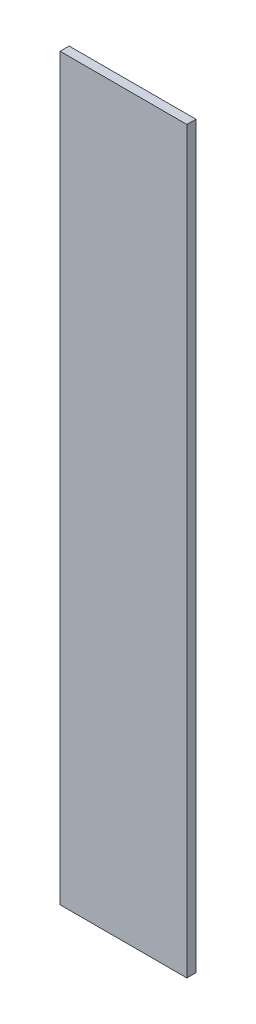
ISO-10303-21;
HEADER;
FILE_DESCRIPTION(('STEP AP214'),'2;1');
FILE_NAME('part.step','',(''),(''),'','','');
FILE_SCHEMA(('AUTOMOTIVE_DESIGN { 1 0 10303 214 1 1 1 1 }'));
ENDSEC;
DATA;
#1=APPLICATION_CONTEXT('core data for automotive mechanical design processes');
#2=APPLICATION_PROTOCOL_DEFINITION('international standard','automotive_design',2000,#1);
#3=PRODUCT_CONTEXT('',#1,'mechanical');
#4=PRODUCT('Part','Part','',(#3));
#5=PRODUCT_RELATED_PRODUCT_CATEGORY('part','',(#4));
#6=PRODUCT_DEFINITION_FORMATION('','',#4);
#7=PRODUCT_DEFINITION_CONTEXT('part definition',#1,'design');
#8=PRODUCT_DEFINITION('design','',#6,#7);
#9=PRODUCT_DEFINITION_SHAPE('','',#8);
#10=(LENGTH_UNIT() NAMED_UNIT(*) SI_UNIT(.MILLI.,.METRE.));
#11=(NAMED_UNIT(*) PLANE_ANGLE_UNIT() SI_UNIT($,.RADIAN.));
#12=(NAMED_UNIT(*) SI_UNIT($,.STERADIAN.) SOLID_ANGLE_UNIT());
#13=UNCERTAINTY_MEASURE_WITH_UNIT(LENGTH_MEASURE(1.E-05),#10,'distance_accuracy_value','');
#14=(GEOMETRIC_REPRESENTATION_CONTEXT(3) GLOBAL_UNCERTAINTY_ASSIGNED_CONTEXT((#13)) GLOBAL_UNIT_ASSIGNED_CONTEXT((#10,
#11,#12)) REPRESENTATION_CONTEXT('',''));
#15=CARTESIAN_POINT('',(0.,0.,0.));
#16=DIRECTION('',(0.,0.,1.));
#17=DIRECTION('',(1.,0.,0.));
#18=AXIS2_PLACEMENT_3D('',#15,#16,#17);
#19=CARTESIAN_POINT('',(0.,0.,6.35));
#20=DIRECTION('',(0.,1.,0.));
#21=DIRECTION('',(0.,0.,1.));
#22=AXIS2_PLACEMENT_3D('',#19,#20,#21);
#23=PLANE('',#22);
#24=DIRECTION('',(1.,0.,0.));
#25=VECTOR('',#24,1.);
#26=CARTESIAN_POINT('',(0.,0.,0.));
#27=LINE('',#26,#25);
#28=CARTESIAN_POINT('',(-88.9,0.,0.));
#29=VERTEX_POINT('',#28);
#30=CARTESIAN_POINT('',(0.,0.,0.));
#31=VERTEX_POINT('',#30);
#32=EDGE_CURVE('E113',#29,#31,#27,.T.);
#33=ORIENTED_EDGE('',*,*,#32,.T.);
#34=DIRECTION('',(0.,0.,-1.));
#35=VECTOR('',#34,1.);
#36=CARTESIAN_POINT('',(0.,0.,6.35));
#37=LINE('',#36,#35);
#38=CARTESIAN_POINT('',(0.,0.,6.35));
#39=VERTEX_POINT('',#38);
#40=EDGE_CURVE('E11',#39,#31,#37,.T.);
#41=ORIENTED_EDGE('',*,*,#40,.F.);
#42=DIRECTION('',(1.,0.,0.));
#43=VECTOR('',#42,1.);
#44=CARTESIAN_POINT('',(0.,0.,6.35));
#45=LINE('',#44,#43);
#46=CARTESIAN_POINT('',(-88.9,0.,6.35));
#47=VERTEX_POINT('',#46);
#48=EDGE_CURVE('E97',#47,#39,#45,.T.);
#49=ORIENTED_EDGE('',*,*,#48,.F.);
#50=DIRECTION('',(0.,0.,-1.));
#51=VECTOR('',#50,1.);
#52=CARTESIAN_POINT('',(-88.9,0.,6.35));
#53=LINE('',#52,#51);
#54=EDGE_CURVE('E109',#47,#29,#53,.T.);
#55=ORIENTED_EDGE('',*,*,#54,.T.);
#56=EDGE_LOOP('',(#33,#41,#49,#55));
#57=FACE_BOUND('',#56,.T.);
#58=ADVANCED_FACE('F45',(#57),#23,.F.);
#59=CARTESIAN_POINT('',(0.,0.,6.35));
#60=DIRECTION('',(-1.,0.,0.));
#61=DIRECTION('',(0.,0.,1.));
#62=AXIS2_PLACEMENT_3D('',#59,#60,#61);
#63=PLANE('',#62);
#64=DIRECTION('',(0.,1.,0.));
#65=VECTOR('',#64,1.);
#66=CARTESIAN_POINT('',(0.,0.,0.));
#67=LINE('',#66,#65);
#68=CARTESIAN_POINT('',(0.,518.16,0.));
#69=VERTEX_POINT('',#68);
#70=EDGE_CURVE('E102',#31,#69,#67,.T.);
#71=ORIENTED_EDGE('',*,*,#70,.T.);
#72=DIRECTION('',(0.,0.,-1.));
#73=VECTOR('',#72,1.);
#74=CARTESIAN_POINT('',(0.,518.16,6.35));
#75=LINE('',#74,#73);
#76=CARTESIAN_POINT('',(0.,518.16,6.35));
#77=VERTEX_POINT('',#76);
#78=EDGE_CURVE('E54',#77,#69,#75,.T.);
#79=ORIENTED_EDGE('',*,*,#78,.F.);
#80=DIRECTION('',(0.,1.,0.));
#81=VECTOR('',#80,1.);
#82=CARTESIAN_POINT('',(0.,0.,6.35));
#83=LINE('',#82,#81);
#84=EDGE_CURVE('E92',#39,#77,#83,.T.);
#85=ORIENTED_EDGE('',*,*,#84,.F.);
#86=ORIENTED_EDGE('',*,*,#40,.T.);
#87=EDGE_LOOP('',(#71,#79,#85,#86));
#88=FACE_BOUND('',#87,.T.);
#89=ADVANCED_FACE('F101',(#88),#63,.F.);
#90=CARTESIAN_POINT('',(0.,518.16,6.35));
#91=DIRECTION('',(0.,-1.,0.));
#92=DIRECTION('',(0.,0.,-1.));
#93=AXIS2_PLACEMENT_3D('',#90,#91,#92);
#94=PLANE('',#93);
#95=DIRECTION('',(-1.,0.,0.));
#96=VECTOR('',#95,1.);
#97=CARTESIAN_POINT('',(0.,518.16,0.));
#98=LINE('',#97,#96);
#99=CARTESIAN_POINT('',(-88.9,518.16,0.));
#100=VERTEX_POINT('',#99);
#101=EDGE_CURVE('E79',#69,#100,#98,.T.);
#102=ORIENTED_EDGE('',*,*,#101,.T.);
#103=DIRECTION('',(0.,0.,-1.));
#104=VECTOR('',#103,1.);
#105=CARTESIAN_POINT('',(-88.9,518.16,6.35));
#106=LINE('',#105,#104);
#107=CARTESIAN_POINT('',(-88.9,518.16,6.35));
#108=VERTEX_POINT('',#107);
#109=EDGE_CURVE('E104',#108,#100,#106,.T.);
#110=ORIENTED_EDGE('',*,*,#109,.F.);
#111=DIRECTION('',(-1.,0.,0.));
#112=VECTOR('',#111,1.);
#113=CARTESIAN_POINT('',(0.,518.16,6.35));
#114=LINE('',#113,#112);
#115=EDGE_CURVE('E95',#77,#108,#114,.T.);
#116=ORIENTED_EDGE('',*,*,#115,.F.);
#117=ORIENTED_EDGE('',*,*,#78,.T.);
#118=EDGE_LOOP('',(#102,#110,#116,#117));
#119=FACE_BOUND('',#118,.T.);
#120=ADVANCED_FACE('F105',(#119),#94,.F.);
#121=CARTESIAN_POINT('',(-88.9,0.,6.35));
#122=DIRECTION('',(1.,0.,0.));
#123=DIRECTION('',(0.,0.,-1.));
#124=AXIS2_PLACEMENT_3D('',#121,#122,#123);
#125=PLANE('',#124);
#126=DIRECTION('',(0.,-1.,0.));
#127=VECTOR('',#126,1.);
#128=CARTESIAN_POINT('',(-88.9,0.,0.));
#129=LINE('',#128,#127);
#130=EDGE_CURVE('E85',#100,#29,#129,.T.);
#131=ORIENTED_EDGE('',*,*,#130,.T.);
#132=ORIENTED_EDGE('',*,*,#54,.F.);
#133=DIRECTION('',(0.,-1.,0.));
#134=VECTOR('',#133,1.);
#135=CARTESIAN_POINT('',(-88.9,0.,6.35));
#136=LINE('',#135,#134);
#137=EDGE_CURVE('E62',#108,#47,#136,.T.);
#138=ORIENTED_EDGE('',*,*,#137,.F.);
#139=ORIENTED_EDGE('',*,*,#109,.T.);
#140=EDGE_LOOP('',(#131,#132,#138,#139));
#141=FACE_BOUND('',#140,.T.);
#142=ADVANCED_FACE('F126',(#141),#125,.F.);
#143=CARTESIAN_POINT('',(0.,0.,6.35));
#144=DIRECTION('',(0.,0.,-1.));
#145=DIRECTION('',(-1.,0.,0.));
#146=AXIS2_PLACEMENT_3D('',#143,#144,#145);
#147=PLANE('',#146);
#148=ORIENTED_EDGE('',*,*,#48,.T.);
#149=ORIENTED_EDGE('',*,*,#84,.T.);
#150=ORIENTED_EDGE('',*,*,#115,.T.);
#151=ORIENTED_EDGE('',*,*,#137,.T.);
#152=EDGE_LOOP('',(#148,#149,#150,#151));
#153=FACE_BOUND('',#152,.T.);
#154=ADVANCED_FACE('F93',(#153),#147,.F.);
#155=CARTESIAN_POINT('',(0.,0.,0.));
#156=DIRECTION('',(0.,0.,-1.));
#157=DIRECTION('',(-1.,0.,0.));
#158=AXIS2_PLACEMENT_3D('',#155,#156,#157);
#159=PLANE('',#158);
#160=ORIENTED_EDGE('',*,*,#32,.F.);
#161=ORIENTED_EDGE('',*,*,#130,.F.);
#162=ORIENTED_EDGE('',*,*,#101,.F.);
#163=ORIENTED_EDGE('',*,*,#70,.F.);
#164=EDGE_LOOP('',(#160,#161,#162,#163));
#165=FACE_BOUND('',#164,.T.);
#166=ADVANCED_FACE('F129',(#165),#159,.T.);
#167=CLOSED_SHELL('',(#58,#89,#120,#142,#154,#166));
#168=MANIFOLD_SOLID_BREP('B2',#167);
#169=ADVANCED_BREP_SHAPE_REPRESENTATION('',(#18,#168),#14);
#170=SHAPE_DEFINITION_REPRESENTATION(#9,#169);
ENDSEC;
END-ISO-10303-21;
